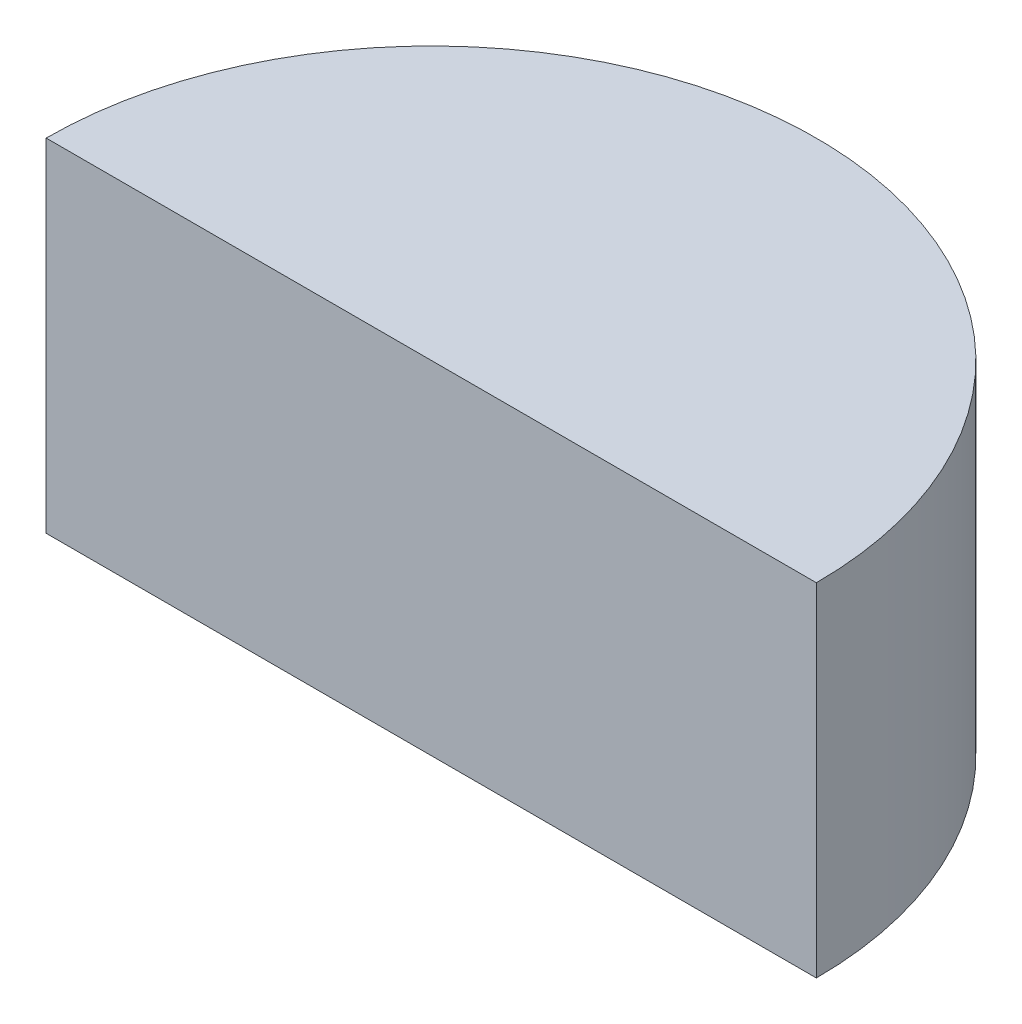
ISO-10303-21;
HEADER;
FILE_DESCRIPTION(('STEP AP214'),'2;1');
FILE_NAME('part.step','',(''),(''),'','','');
FILE_SCHEMA(('AUTOMOTIVE_DESIGN { 1 0 10303 214 1 1 1 1 }'));
ENDSEC;
DATA;
#1=APPLICATION_CONTEXT('core data for automotive mechanical design processes');
#2=APPLICATION_PROTOCOL_DEFINITION('international standard','automotive_design',2000,#1);
#3=PRODUCT_CONTEXT('',#1,'mechanical');
#4=PRODUCT('Part','Part','',(#3));
#5=PRODUCT_RELATED_PRODUCT_CATEGORY('part','',(#4));
#6=PRODUCT_DEFINITION_FORMATION('','',#4);
#7=PRODUCT_DEFINITION_CONTEXT('part definition',#1,'design');
#8=PRODUCT_DEFINITION('design','',#6,#7);
#9=PRODUCT_DEFINITION_SHAPE('','',#8);
#10=(LENGTH_UNIT() NAMED_UNIT(*) SI_UNIT(.MILLI.,.METRE.));
#11=(NAMED_UNIT(*) PLANE_ANGLE_UNIT() SI_UNIT($,.RADIAN.));
#12=(NAMED_UNIT(*) SI_UNIT($,.STERADIAN.) SOLID_ANGLE_UNIT());
#13=UNCERTAINTY_MEASURE_WITH_UNIT(LENGTH_MEASURE(1.E-05),#10,'distance_accuracy_value','');
#14=(GEOMETRIC_REPRESENTATION_CONTEXT(3) GLOBAL_UNCERTAINTY_ASSIGNED_CONTEXT((#13)) GLOBAL_UNIT_ASSIGNED_CONTEXT((#10,
#11,#12)) REPRESENTATION_CONTEXT('',''));
#15=CARTESIAN_POINT('',(0.,0.,0.));
#16=DIRECTION('',(0.,0.,1.));
#17=DIRECTION('',(1.,0.,0.));
#18=AXIS2_PLACEMENT_3D('',#15,#16,#17);
#19=CARTESIAN_POINT('',(0.,2.,0.));
#20=DIRECTION('',(0.,-1.,0.));
#21=DIRECTION('',(0.,0.,-1.));
#22=AXIS2_PLACEMENT_3D('',#19,#20,#21);
#23=CYLINDRICAL_SURFACE('',#22,2.25);
#24=CARTESIAN_POINT('',(0.,0.,0.));
#25=DIRECTION('',(0.,1.,0.));
#26=DIRECTION('',(0.,0.,1.));
#27=AXIS2_PLACEMENT_3D('',#24,#25,#26);
#28=CIRCLE('',#27,2.25);
#29=CARTESIAN_POINT('',(2.25,0.,0.));
#30=VERTEX_POINT('',#29);
#31=CARTESIAN_POINT('',(-2.25,0.,0.));
#32=VERTEX_POINT('',#31);
#33=EDGE_CURVE('E73',#30,#32,#28,.T.);
#34=ORIENTED_EDGE('',*,*,#33,.T.);
#35=DIRECTION('',(0.,-1.,0.));
#36=VECTOR('',#35,1.);
#37=CARTESIAN_POINT('',(-2.25,2.,0.));
#38=LINE('',#37,#36);
#39=CARTESIAN_POINT('',(-2.25,2.,0.));
#40=VERTEX_POINT('',#39);
#41=EDGE_CURVE('E11',#40,#32,#38,.T.);
#42=ORIENTED_EDGE('',*,*,#41,.F.);
#43=CARTESIAN_POINT('',(0.,2.,0.));
#44=DIRECTION('',(0.,1.,0.));
#45=DIRECTION('',(0.,0.,1.));
#46=AXIS2_PLACEMENT_3D('',#43,#44,#45);
#47=CIRCLE('',#46,2.25);
#48=CARTESIAN_POINT('',(2.25,2.,0.));
#49=VERTEX_POINT('',#48);
#50=EDGE_CURVE('E72',#49,#40,#47,.T.);
#51=ORIENTED_EDGE('',*,*,#50,.F.);
#52=DIRECTION('',(0.,-1.,0.));
#53=VECTOR('',#52,1.);
#54=CARTESIAN_POINT('',(2.25,2.,0.));
#55=LINE('',#54,#53);
#56=EDGE_CURVE('E50',#49,#30,#55,.T.);
#57=ORIENTED_EDGE('',*,*,#56,.T.);
#58=EDGE_LOOP('',(#34,#42,#51,#57));
#59=FACE_BOUND('',#58,.T.);
#60=ADVANCED_FACE('F42',(#59),#23,.T.);
#61=CARTESIAN_POINT('',(-2.25,2.,0.));
#62=DIRECTION('',(0.,0.,-1.));
#63=DIRECTION('',(-1.,0.,0.));
#64=AXIS2_PLACEMENT_3D('',#61,#62,#63);
#65=PLANE('',#64);
#66=DIRECTION('',(1.,0.,0.));
#67=VECTOR('',#66,1.);
#68=CARTESIAN_POINT('',(-2.25,0.,0.));
#69=LINE('',#68,#67);
#70=EDGE_CURVE('E65',#32,#30,#69,.T.);
#71=ORIENTED_EDGE('',*,*,#70,.T.);
#72=ORIENTED_EDGE('',*,*,#56,.F.);
#73=DIRECTION('',(1.,0.,0.));
#74=VECTOR('',#73,1.);
#75=CARTESIAN_POINT('',(-2.25,2.,0.));
#76=LINE('',#75,#74);
#77=EDGE_CURVE('E57',#40,#49,#76,.T.);
#78=ORIENTED_EDGE('',*,*,#77,.F.);
#79=ORIENTED_EDGE('',*,*,#41,.T.);
#80=EDGE_LOOP('',(#71,#72,#78,#79));
#81=FACE_BOUND('',#80,.T.);
#82=ADVANCED_FACE('F68',(#81),#65,.F.);
#83=CARTESIAN_POINT('',(0.,2.,0.));
#84=DIRECTION('',(0.,1.,0.));
#85=DIRECTION('',(0.,0.,1.));
#86=AXIS2_PLACEMENT_3D('',#83,#84,#85);
#87=PLANE('',#86);
#88=ORIENTED_EDGE('',*,*,#50,.T.);
#89=ORIENTED_EDGE('',*,*,#77,.T.);
#90=EDGE_LOOP('',(#88,#89));
#91=FACE_BOUND('',#90,.T.);
#92=ADVANCED_FACE('F80',(#91),#87,.T.);
#93=CARTESIAN_POINT('',(0.,0.,0.));
#94=DIRECTION('',(0.,1.,0.));
#95=DIRECTION('',(0.,0.,1.));
#96=AXIS2_PLACEMENT_3D('',#93,#94,#95);
#97=PLANE('',#96);
#98=ORIENTED_EDGE('',*,*,#33,.F.);
#99=ORIENTED_EDGE('',*,*,#70,.F.);
#100=EDGE_LOOP('',(#98,#99));
#101=FACE_BOUND('',#100,.T.);
#102=ADVANCED_FACE('F76',(#101),#97,.F.);
#103=CLOSED_SHELL('',(#60,#82,#92,#102));
#104=MANIFOLD_SOLID_BREP('B2',#103);
#105=ADVANCED_BREP_SHAPE_REPRESENTATION('',(#18,#104),#14);
#106=SHAPE_DEFINITION_REPRESENTATION(#9,#105);
ENDSEC;
END-ISO-10303-21;
